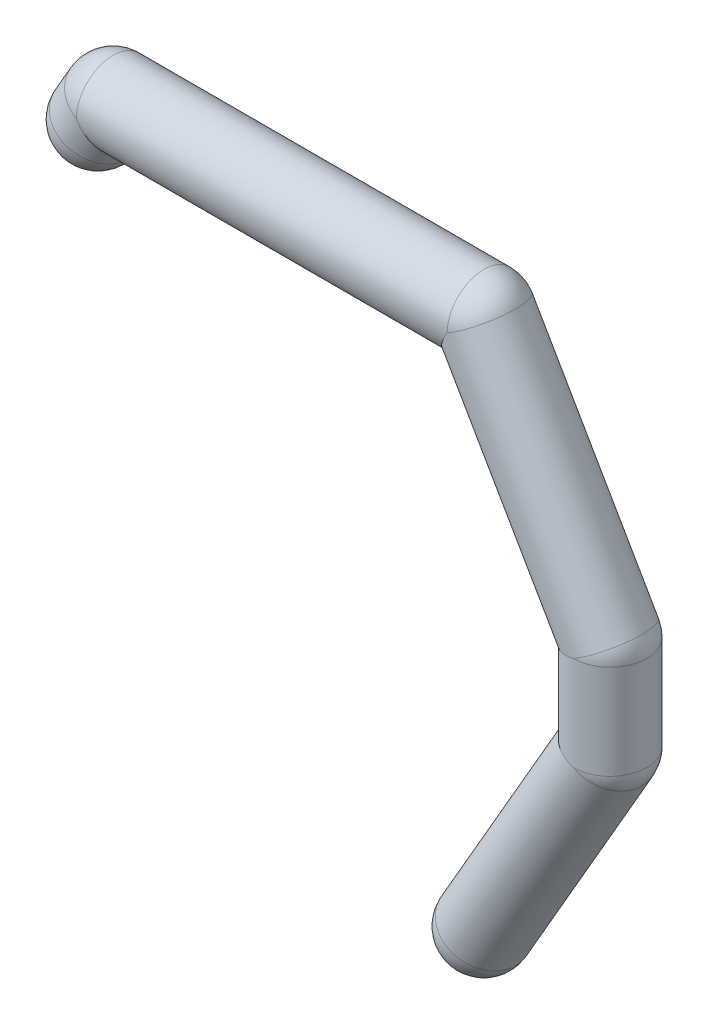
ISO-10303-21;
HEADER;
FILE_DESCRIPTION(('STEP AP214'),'2;1');
FILE_NAME('part.step','',(''),(''),'','','');
FILE_SCHEMA(('AUTOMOTIVE_DESIGN { 1 0 10303 214 1 1 1 1 }'));
ENDSEC;
DATA;
#1=APPLICATION_CONTEXT('core data for automotive mechanical design processes');
#2=APPLICATION_PROTOCOL_DEFINITION('international standard','automotive_design',2000,#1);
#3=PRODUCT_CONTEXT('',#1,'mechanical');
#4=PRODUCT('Part','Part','',(#3));
#5=PRODUCT_RELATED_PRODUCT_CATEGORY('part','',(#4));
#6=PRODUCT_DEFINITION_FORMATION('','',#4);
#7=PRODUCT_DEFINITION_CONTEXT('part definition',#1,'design');
#8=PRODUCT_DEFINITION('design','',#6,#7);
#9=PRODUCT_DEFINITION_SHAPE('','',#8);
#10=(LENGTH_UNIT() NAMED_UNIT(*) SI_UNIT(.MILLI.,.METRE.));
#11=(NAMED_UNIT(*) PLANE_ANGLE_UNIT() SI_UNIT($,.RADIAN.));
#12=(NAMED_UNIT(*) SI_UNIT($,.STERADIAN.) SOLID_ANGLE_UNIT());
#13=UNCERTAINTY_MEASURE_WITH_UNIT(LENGTH_MEASURE(1.E-05),#10,'distance_accuracy_value','');
#14=(GEOMETRIC_REPRESENTATION_CONTEXT(3) GLOBAL_UNCERTAINTY_ASSIGNED_CONTEXT((#13)) GLOBAL_UNIT_ASSIGNED_CONTEXT((#10,
#11,#12)) REPRESENTATION_CONTEXT('',''));
#15=CARTESIAN_POINT('',(0.,0.,0.));
#16=DIRECTION('',(0.,0.,1.));
#17=DIRECTION('',(1.,0.,0.));
#18=AXIS2_PLACEMENT_3D('',#15,#16,#17);
#19=CARTESIAN_POINT('',(18.741,-9.6,0.825));
#20=DIRECTION('',(1.,0.,0.));
#21=DIRECTION('',(0.,-1.,0.));
#22=AXIS2_PLACEMENT_3D('',#19,#20,#21);
#23=SPHERICAL_SURFACE('',#22,0.24);
#24=CARTESIAN_POINT('',(18.741,-9.6,0.825));
#25=DIRECTION('',(-1.,0.,0.));
#26=DIRECTION('',(0.,0.,1.));
#27=AXIS2_PLACEMENT_3D('',#24,#25,#26);
#28=CIRCLE('',#27,0.24);
#29=CARTESIAN_POINT('',(18.741,-9.59999999999999,0.585));
#30=VERTEX_POINT('',#29);
#31=CARTESIAN_POINT('',(18.741,-9.59999999999999,1.065));
#32=VERTEX_POINT('',#31);
#33=EDGE_CURVE('E99',#30,#32,#28,.F.);
#34=ORIENTED_EDGE('',*,*,#33,.F.);
#35=CARTESIAN_POINT('',(18.741,-9.59999999999999,0.825));
#36=DIRECTION('',(-0.498849762392088,-0.866688476075088,0.));
#37=DIRECTION('',(0.866688476075088,-0.498849762392088,0.));
#38=AXIS2_PLACEMENT_3D('',#35,#36,#37);
#39=CIRCLE('',#38,0.239999999999999);
#40=EDGE_CURVE('E106',#32,#30,#39,.T.);
#41=ORIENTED_EDGE('',*,*,#40,.F.);
#42=EDGE_LOOP('',(#34,#41));
#43=FACE_BOUND('',#42,.T.);
#44=ADVANCED_FACE('F63',(#43),#23,.T.);
#45=CARTESIAN_POINT('',(21.166,-9.6,0.825));
#46=DIRECTION('',(-1.,0.,0.));
#47=DIRECTION('',(0.,0.,1.));
#48=AXIS2_PLACEMENT_3D('',#45,#46,#47);
#49=CYLINDRICAL_SURFACE('',#48,0.24);
#50=CARTESIAN_POINT('',(18.741,-9.6,0.825));
#51=DIRECTION('',(-0.865693295108629,-0.500574788422234,0.));
#52=DIRECTION('',(-0.500574788422235,0.865693295108629,0.));
#53=AXIS2_PLACEMENT_3D('',#50,#51,#52);
#54=ELLIPSE('',#53,0.27723444475781,0.239999999999999);
#55=EDGE_CURVE('E76',#30,#32,#54,.T.);
#56=ORIENTED_EDGE('',*,*,#55,.F.);
#57=ORIENTED_EDGE('',*,*,#33,.T.);
#58=EDGE_LOOP('',(#56,#57));
#59=FACE_BOUND('',#58,.T.);
#60=CARTESIAN_POINT('',(21.166,-9.6,0.825));
#61=DIRECTION('',(-0.866000737383216,0.50004272102664,0.));
#62=DIRECTION('',(-0.500042721026639,-0.866000737383216,0.));
#63=AXIS2_PLACEMENT_3D('',#60,#61,#62);
#64=ELLIPSE('',#63,0.277136022684236,0.24);
#65=CARTESIAN_POINT('',(21.166,-9.6,1.065));
#66=VERTEX_POINT('',#65);
#67=CARTESIAN_POINT('',(21.166,-9.6,0.585));
#68=VERTEX_POINT('',#67);
#69=EDGE_CURVE('E70',#66,#68,#64,.F.);
#70=ORIENTED_EDGE('',*,*,#69,.F.);
#71=CARTESIAN_POINT('',(21.166,-9.6,0.825));
#72=DIRECTION('',(-1.,0.,0.));
#73=DIRECTION('',(0.,0.,1.));
#74=AXIS2_PLACEMENT_3D('',#71,#72,#73);
#75=CIRCLE('',#74,0.24);
#76=EDGE_CURVE('E104',#66,#68,#75,.T.);
#77=ORIENTED_EDGE('',*,*,#76,.T.);
#78=EDGE_LOOP('',(#70,#77));
#79=FACE_BOUND('',#78,.T.);
#80=ADVANCED_FACE('F101',(#59,#79),#49,.T.);
#81=CARTESIAN_POINT('',(21.166,-9.6,0.825));
#82=DIRECTION('',(1.,0.,0.));
#83=DIRECTION('',(0.,-1.,0.));
#84=AXIS2_PLACEMENT_3D('',#81,#82,#83);
#85=SPHERICAL_SURFACE('',#84,0.24);
#86=ORIENTED_EDGE('',*,*,#76,.F.);
#87=CARTESIAN_POINT('',(21.166,-9.6,0.825));
#88=DIRECTION('',(-0.499914554296548,0.86607473026436,0.));
#89=DIRECTION('',(-0.86607473026436,-0.499914554296548,0.));
#90=AXIS2_PLACEMENT_3D('',#87,#88,#89);
#91=CIRCLE('',#90,0.24);
#92=EDGE_CURVE('E128',#68,#66,#91,.F.);
#93=ORIENTED_EDGE('',*,*,#92,.F.);
#94=EDGE_LOOP('',(#86,#93));
#95=FACE_BOUND('',#94,.T.);
#96=ADVANCED_FACE('F138',(#95),#85,.T.);
#97=CARTESIAN_POINT('',(21.992,-11.031,0.825));
#98=DIRECTION('',(-0.499914554296548,0.86607473026436,0.));
#99=DIRECTION('',(-0.86607473026436,-0.499914554296548,0.));
#100=AXIS2_PLACEMENT_3D('',#97,#98,#99);
#101=CYLINDRICAL_SURFACE('',#100,0.24);
#102=CARTESIAN_POINT('',(21.992,-11.031,0.825));
#103=DIRECTION('',(-0.258771394995313,0.965938592837133,0.));
#104=DIRECTION('',(-0.965938592837133,-0.258771394995312,0.));
#105=AXIS2_PLACEMENT_3D('',#102,#103,#104);
#106=ELLIPSE('',#105,0.248462999387029,0.24);
#107=CARTESIAN_POINT('',(21.992,-11.031,1.065));
#108=VERTEX_POINT('',#107);
#109=CARTESIAN_POINT('',(21.992,-11.031,0.585));
#110=VERTEX_POINT('',#109);
#111=EDGE_CURVE('E131',#108,#110,#106,.F.);
#112=ORIENTED_EDGE('',*,*,#111,.F.);
#113=CARTESIAN_POINT('',(21.992,-11.031,0.825));
#114=DIRECTION('',(-0.499914554296552,0.866074730264358,0.));
#115=DIRECTION('',(-0.866074730264358,-0.499914554296552,0.));
#116=AXIS2_PLACEMENT_3D('',#113,#114,#115);
#117=CIRCLE('',#116,0.24);
#118=EDGE_CURVE('E126',#108,#110,#117,.T.);
#119=ORIENTED_EDGE('',*,*,#118,.T.);
#120=EDGE_LOOP('',(#112,#119));
#121=FACE_BOUND('',#120,.T.);
#122=ORIENTED_EDGE('',*,*,#92,.T.);
#123=ORIENTED_EDGE('',*,*,#69,.T.);
#124=EDGE_LOOP('',(#122,#123));
#125=FACE_BOUND('',#124,.T.);
#126=ADVANCED_FACE('F136',(#121,#125),#101,.T.);
#127=CARTESIAN_POINT('',(21.992,-11.031,0.825));
#128=DIRECTION('',(1.,0.,0.));
#129=DIRECTION('',(0.,-1.,0.));
#130=AXIS2_PLACEMENT_3D('',#127,#128,#129);
#131=SPHERICAL_SURFACE('',#130,0.24);
#132=ORIENTED_EDGE('',*,*,#118,.F.);
#133=CARTESIAN_POINT('',(21.992,-11.031,0.825));
#134=DIRECTION('',(0.,1.,0.));
#135=DIRECTION('',(0.,0.,1.));
#136=AXIS2_PLACEMENT_3D('',#133,#134,#135);
#137=CIRCLE('',#136,0.24);
#138=EDGE_CURVE('E120',#110,#108,#137,.F.);
#139=ORIENTED_EDGE('',*,*,#138,.F.);
#140=EDGE_LOOP('',(#132,#139));
#141=FACE_BOUND('',#140,.T.);
#142=ADVANCED_FACE('F152',(#141),#131,.T.);
#143=CARTESIAN_POINT('',(21.992,-11.649,0.825));
#144=DIRECTION('',(0.,1.,0.));
#145=DIRECTION('',(0.,0.,1.));
#146=AXIS2_PLACEMENT_3D('',#143,#144,#145);
#147=CYLINDRICAL_SURFACE('',#146,0.240000000000001);
#148=CARTESIAN_POINT('',(21.992,-11.649,0.825));
#149=DIRECTION('',(0.258771394995313,0.965938592837132,0.));
#150=DIRECTION('',(-0.965938592837132,0.258771394995313,0.));
#151=AXIS2_PLACEMENT_3D('',#148,#149,#150);
#152=ELLIPSE('',#151,0.248462999387029,0.24);
#153=CARTESIAN_POINT('',(21.992,-11.649,1.065));
#154=VERTEX_POINT('',#153);
#155=CARTESIAN_POINT('',(21.992,-11.649,0.584999999999999));
#156=VERTEX_POINT('',#155);
#157=EDGE_CURVE('E123',#154,#156,#152,.F.);
#158=ORIENTED_EDGE('',*,*,#157,.F.);
#159=CARTESIAN_POINT('',(21.992,-11.649,0.825));
#160=DIRECTION('',(0.,1.,0.));
#161=DIRECTION('',(0.,0.,1.));
#162=AXIS2_PLACEMENT_3D('',#159,#160,#161);
#163=CIRCLE('',#162,0.240000000000001);
#164=EDGE_CURVE('E117',#154,#156,#163,.T.);
#165=ORIENTED_EDGE('',*,*,#164,.T.);
#166=EDGE_LOOP('',(#158,#165));
#167=FACE_BOUND('',#166,.T.);
#168=ORIENTED_EDGE('',*,*,#138,.T.);
#169=ORIENTED_EDGE('',*,*,#111,.T.);
#170=EDGE_LOOP('',(#168,#169));
#171=FACE_BOUND('',#170,.T.);
#172=ADVANCED_FACE('F156',(#167,#171),#147,.T.);
#173=CARTESIAN_POINT('',(21.992,-11.649,0.825));
#174=DIRECTION('',(1.,0.,0.));
#175=DIRECTION('',(0.,-1.,0.));
#176=AXIS2_PLACEMENT_3D('',#173,#174,#175);
#177=SPHERICAL_SURFACE('',#176,0.24);
#178=ORIENTED_EDGE('',*,*,#164,.F.);
#179=CARTESIAN_POINT('',(21.992,-11.649,0.825));
#180=DIRECTION('',(0.499914554296553,0.866074730264357,0.));
#181=DIRECTION('',(-0.866074730264357,0.499914554296553,0.));
#182=AXIS2_PLACEMENT_3D('',#179,#180,#181);
#183=CIRCLE('',#182,0.24);
#184=EDGE_CURVE('E113',#154,#156,#183,.T.);
#185=ORIENTED_EDGE('',*,*,#184,.T.);
#186=EDGE_LOOP('',(#178,#185));
#187=FACE_BOUND('',#186,.T.);
#188=ADVANCED_FACE('F160',(#187),#177,.T.);
#189=CARTESIAN_POINT('',(21.166,-13.08,0.825));
#190=DIRECTION('',(0.499914554296549,0.86607473026436,0.));
#191=DIRECTION('',(-0.86607473026436,0.499914554296549,0.));
#192=AXIS2_PLACEMENT_3D('',#189,#190,#191);
#193=CYLINDRICAL_SURFACE('',#192,0.24);
#194=ORIENTED_EDGE('',*,*,#184,.F.);
#195=ORIENTED_EDGE('',*,*,#157,.T.);
#196=EDGE_LOOP('',(#194,#195));
#197=FACE_BOUND('',#196,.T.);
#198=CARTESIAN_POINT('',(21.166,-13.08,0.825));
#199=DIRECTION('',(0.499914554296553,0.866074730264357,0.));
#200=DIRECTION('',(-0.866074730264357,0.499914554296553,0.));
#201=AXIS2_PLACEMENT_3D('',#198,#199,#200);
#202=CIRCLE('',#201,0.24);
#203=CARTESIAN_POINT('',(20.9581420647365,-12.9600205069688,0.825));
#204=VERTEX_POINT('',#203);
#205=EDGE_CURVE('E110',#204,#204,#202,.T.);
#206=ORIENTED_EDGE('',*,*,#205,.T.);
#207=EDGE_LOOP('',(#206));
#208=FACE_BOUND('',#207,.T.);
#209=ADVANCED_FACE('F165',(#197,#208),#193,.T.);
#210=CARTESIAN_POINT('',(21.166,-13.08,0.825));
#211=DIRECTION('',(1.,0.,0.));
#212=DIRECTION('',(0.,-1.,0.));
#213=AXIS2_PLACEMENT_3D('',#210,#211,#212);
#214=SPHERICAL_SURFACE('',#213,0.24);
#215=CARTESIAN_POINT('',(21.166,-13.08,0.825));
#216=DIRECTION('',(0.499914554296553,0.866074730264357,0.));
#217=DIRECTION('',(-0.866074730264357,0.499914554296553,0.));
#218=AXIS2_PLACEMENT_3D('',#215,#216,#217);
#219=SPHERICAL_SURFACE('',#218,0.24);
#220=ORIENTED_EDGE('',*,*,#205,.F.);
#221=EDGE_LOOP('',(#220));
#222=FACE_BOUND('',#221,.T.);
#223=ADVANCED_FACE('F162',(#222),#219,.T.);
#224=CARTESIAN_POINT('',(18.741,-9.59999999999999,0.825));
#225=DIRECTION('',(-0.49884976239207,-0.866688476075097,0.));
#226=DIRECTION('',(0.866688476075098,-0.498849762392071,0.));
#227=AXIS2_PLACEMENT_3D('',#224,#225,#226);
#228=CYLINDRICAL_SURFACE('',#227,0.239999999999999);
#229=CARTESIAN_POINT('',(18.642,-9.772,0.825));
#230=DIRECTION('',(-0.49884976239207,-0.866688476075097,0.));
#231=DIRECTION('',(0.866688476075098,-0.498849762392071,0.));
#232=AXIS2_PLACEMENT_3D('',#229,#230,#231);
#233=CIRCLE('',#232,0.24);
#234=CARTESIAN_POINT('',(18.850005234258,-9.89172394297409,0.825));
#235=VERTEX_POINT('',#234);
#236=EDGE_CURVE('E12',#235,#235,#233,.F.);
#237=ORIENTED_EDGE('',*,*,#236,.T.);
#238=EDGE_LOOP('',(#237));
#239=FACE_BOUND('',#238,.T.);
#240=ORIENTED_EDGE('',*,*,#40,.T.);
#241=ORIENTED_EDGE('',*,*,#55,.T.);
#242=EDGE_LOOP('',(#240,#241));
#243=FACE_BOUND('',#242,.T.);
#244=ADVANCED_FACE('F109',(#239,#243),#228,.T.);
#245=CARTESIAN_POINT('',(18.642,-9.772,0.825));
#246=DIRECTION('',(1.,0.,0.));
#247=DIRECTION('',(0.,-1.,0.));
#248=AXIS2_PLACEMENT_3D('',#245,#246,#247);
#249=SPHERICAL_SURFACE('',#248,0.24);
#250=CARTESIAN_POINT('',(18.642,-9.772,0.825));
#251=DIRECTION('',(-0.498849762392071,-0.866688476075098,0.));
#252=DIRECTION('',(0.866688476075098,-0.498849762392071,0.));
#253=AXIS2_PLACEMENT_3D('',#250,#251,#252);
#254=SPHERICAL_SURFACE('',#253,0.24);
#255=ORIENTED_EDGE('',*,*,#236,.F.);
#256=EDGE_LOOP('',(#255));
#257=FACE_BOUND('',#256,.T.);
#258=ADVANCED_FACE('F146',(#257),#254,.T.);
#259=CLOSED_SHELL('',(#44,#80,#96,#126,#142,#172,#188,#209,#223,#244,#258));
#260=MANIFOLD_SOLID_BREP('B2',#259);
#261=ADVANCED_BREP_SHAPE_REPRESENTATION('',(#18,#260),#14);
#262=SHAPE_DEFINITION_REPRESENTATION(#9,#261);
ENDSEC;
END-ISO-10303-21;
